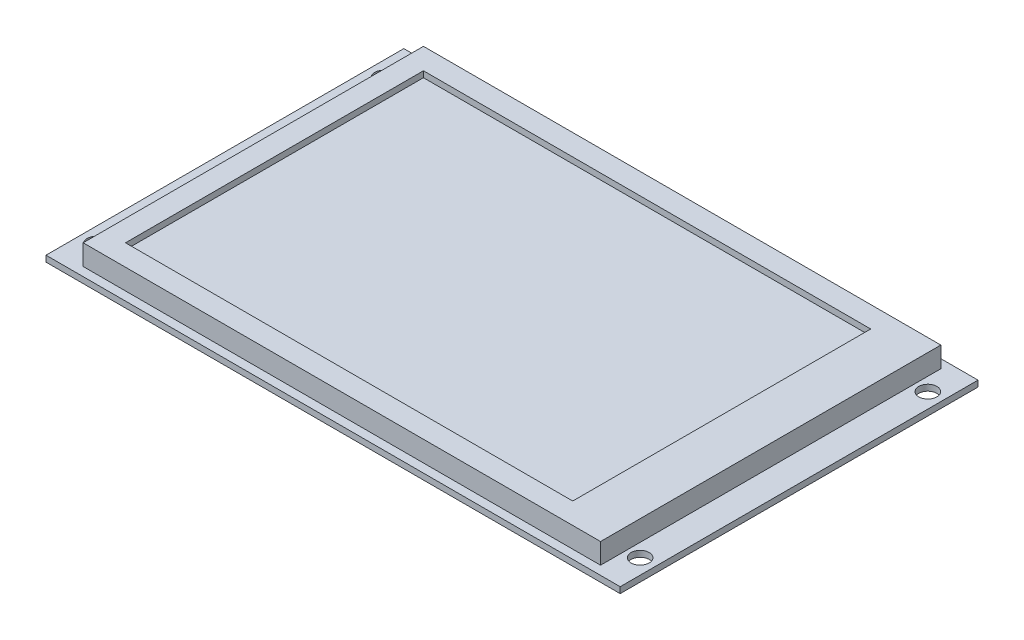
ISO-10303-21;
HEADER;
FILE_DESCRIPTION(('STEP AP214'),'2;1');
FILE_NAME('part.step','',(''),(''),'','','');
FILE_SCHEMA(('AUTOMOTIVE_DESIGN { 1 0 10303 214 1 1 1 1 }'));
ENDSEC;
DATA;
#1=APPLICATION_CONTEXT('core data for automotive mechanical design processes');
#2=APPLICATION_PROTOCOL_DEFINITION('international standard','automotive_design',2000,#1);
#3=PRODUCT_CONTEXT('',#1,'mechanical');
#4=PRODUCT('Part','Part','',(#3));
#5=PRODUCT_RELATED_PRODUCT_CATEGORY('part','',(#4));
#6=PRODUCT_DEFINITION_FORMATION('','',#4);
#7=PRODUCT_DEFINITION_CONTEXT('part definition',#1,'design');
#8=PRODUCT_DEFINITION('design','',#6,#7);
#9=PRODUCT_DEFINITION_SHAPE('','',#8);
#10=(LENGTH_UNIT() NAMED_UNIT(*) SI_UNIT(.MILLI.,.METRE.));
#11=(NAMED_UNIT(*) PLANE_ANGLE_UNIT() SI_UNIT($,.RADIAN.));
#12=(NAMED_UNIT(*) SI_UNIT($,.STERADIAN.) SOLID_ANGLE_UNIT());
#13=UNCERTAINTY_MEASURE_WITH_UNIT(LENGTH_MEASURE(1.E-05),#10,'distance_accuracy_value','');
#14=(GEOMETRIC_REPRESENTATION_CONTEXT(3) GLOBAL_UNCERTAINTY_ASSIGNED_CONTEXT((#13)) GLOBAL_UNIT_ASSIGNED_CONTEXT((#10,
#11,#12)) REPRESENTATION_CONTEXT('',''));
#15=CARTESIAN_POINT('',(0.,0.,0.));
#16=DIRECTION('',(0.,0.,1.));
#17=DIRECTION('',(1.,0.,0.));
#18=AXIS2_PLACEMENT_3D('',#15,#16,#17);
#19=CARTESIAN_POINT('',(0.,1.,0.));
#20=DIRECTION('',(0.,-1.,0.));
#21=DIRECTION('',(0.,0.,-1.));
#22=AXIS2_PLACEMENT_3D('',#19,#20,#21);
#23=PLANE('',#22);
#24=CARTESIAN_POINT('',(-45.35,1.,9.63000000000003));
#25=DIRECTION('',(0.,1.,0.));
#26=DIRECTION('',(0.,0.,1.));
#27=AXIS2_PLACEMENT_3D('',#24,#25,#26);
#28=CIRCLE('',#27,0.499999999999999);
#29=CARTESIAN_POINT('',(-45.35,1.,10.13));
#30=VERTEX_POINT('',#29);
#31=EDGE_CURVE('E249',#30,#30,#28,.T.);
#32=ORIENTED_EDGE('',*,*,#31,.F.);
#33=EDGE_LOOP('',(#32));
#34=FACE_BOUND('',#33,.T.);
#35=CARTESIAN_POINT('',(-45.35,1.,7.09000000000003));
#36=DIRECTION('',(0.,1.,0.));
#37=DIRECTION('',(0.,0.,1.));
#38=AXIS2_PLACEMENT_3D('',#35,#36,#37);
#39=CIRCLE('',#38,0.499999999999999);
#40=CARTESIAN_POINT('',(-45.35,1.,7.59000000000003));
#41=VERTEX_POINT('',#40);
#42=EDGE_CURVE('E704',#41,#41,#39,.T.);
#43=ORIENTED_EDGE('',*,*,#42,.F.);
#44=EDGE_LOOP('',(#43));
#45=FACE_BOUND('',#44,.T.);
#46=CARTESIAN_POINT('',(-45.35,1.,4.55000000000003));
#47=DIRECTION('',(0.,1.,0.));
#48=DIRECTION('',(0.,0.,1.));
#49=AXIS2_PLACEMENT_3D('',#46,#47,#48);
#50=CIRCLE('',#49,0.499999999999999);
#51=CARTESIAN_POINT('',(-45.35,1.,5.05000000000003));
#52=VERTEX_POINT('',#51);
#53=EDGE_CURVE('E707',#52,#52,#50,.T.);
#54=ORIENTED_EDGE('',*,*,#53,.F.);
#55=EDGE_LOOP('',(#54));
#56=FACE_BOUND('',#55,.T.);
#57=CARTESIAN_POINT('',(-45.35,1.,2.01000000000003));
#58=DIRECTION('',(0.,1.,0.));
#59=DIRECTION('',(0.,0.,1.));
#60=AXIS2_PLACEMENT_3D('',#57,#58,#59);
#61=CIRCLE('',#60,0.499999999999999);
#62=CARTESIAN_POINT('',(-45.35,1.,2.51000000000003));
#63=VERTEX_POINT('',#62);
#64=EDGE_CURVE('E712',#63,#63,#61,.T.);
#65=ORIENTED_EDGE('',*,*,#64,.F.);
#66=EDGE_LOOP('',(#65));
#67=FACE_BOUND('',#66,.T.);
#68=CARTESIAN_POINT('',(-45.35,1.,-0.529999999999971));
#69=DIRECTION('',(0.,1.,0.));
#70=DIRECTION('',(0.,0.,1.));
#71=AXIS2_PLACEMENT_3D('',#68,#69,#70);
#72=CIRCLE('',#71,0.499999999999999);
#73=CARTESIAN_POINT('',(-45.35,1.,-0.0299999999999723));
#74=VERTEX_POINT('',#73);
#75=EDGE_CURVE('E715',#74,#74,#72,.T.);
#76=ORIENTED_EDGE('',*,*,#75,.F.);
#77=EDGE_LOOP('',(#76));
#78=FACE_BOUND('',#77,.T.);
#79=CARTESIAN_POINT('',(-45.35,1.,-3.06999999999997));
#80=DIRECTION('',(0.,1.,0.));
#81=DIRECTION('',(0.,0.,1.));
#82=AXIS2_PLACEMENT_3D('',#79,#80,#81);
#83=CIRCLE('',#82,0.499999999999999);
#84=CARTESIAN_POINT('',(-45.35,1.,-2.56999999999997));
#85=VERTEX_POINT('',#84);
#86=EDGE_CURVE('E718',#85,#85,#83,.T.);
#87=ORIENTED_EDGE('',*,*,#86,.F.);
#88=EDGE_LOOP('',(#87));
#89=FACE_BOUND('',#88,.T.);
#90=CARTESIAN_POINT('',(-45.35,1.,-5.60999999999997));
#91=DIRECTION('',(0.,1.,0.));
#92=DIRECTION('',(0.,0.,1.));
#93=AXIS2_PLACEMENT_3D('',#90,#91,#92);
#94=CIRCLE('',#93,0.499999999999999);
#95=CARTESIAN_POINT('',(-45.35,1.,-5.10999999999997));
#96=VERTEX_POINT('',#95);
#97=EDGE_CURVE('E721',#96,#96,#94,.T.);
#98=ORIENTED_EDGE('',*,*,#97,.F.);
#99=EDGE_LOOP('',(#98));
#100=FACE_BOUND('',#99,.T.);
#101=CARTESIAN_POINT('',(-45.35,1.,-8.14999999999997));
#102=DIRECTION('',(0.,1.,0.));
#103=DIRECTION('',(0.,0.,1.));
#104=AXIS2_PLACEMENT_3D('',#101,#102,#103);
#105=CIRCLE('',#104,0.499999999999999);
#106=CARTESIAN_POINT('',(-45.35,1.,-7.64999999999997));
#107=VERTEX_POINT('',#106);
#108=EDGE_CURVE('E723',#107,#107,#105,.T.);
#109=ORIENTED_EDGE('',*,*,#108,.F.);
#110=EDGE_LOOP('',(#109));
#111=FACE_BOUND('',#110,.T.);
#112=CARTESIAN_POINT('',(-45.35,1.,-10.69));
#113=DIRECTION('',(0.,1.,0.));
#114=DIRECTION('',(0.,0.,1.));
#115=AXIS2_PLACEMENT_3D('',#112,#113,#114);
#116=CIRCLE('',#115,0.499999999999999);
#117=CARTESIAN_POINT('',(-45.35,1.,-10.19));
#118=VERTEX_POINT('',#117);
#119=EDGE_CURVE('E283',#118,#118,#116,.T.);
#120=ORIENTED_EDGE('',*,*,#119,.F.);
#121=EDGE_LOOP('',(#120));
#122=FACE_BOUND('',#121,.T.);
#123=CARTESIAN_POINT('',(45.,1.,-23.8));
#124=DIRECTION('',(0.,1.,0.));
#125=DIRECTION('',(0.,0.,-1.));
#126=AXIS2_PLACEMENT_3D('',#123,#124,#125);
#127=CIRCLE('',#126,1.5);
#128=CARTESIAN_POINT('',(45.,1.,-25.3));
#129=VERTEX_POINT('',#128);
#130=EDGE_CURVE('E280',#129,#129,#127,.T.);
#131=ORIENTED_EDGE('',*,*,#130,.F.);
#132=EDGE_LOOP('',(#131));
#133=FACE_BOUND('',#132,.T.);
#134=CARTESIAN_POINT('',(-45.,1.,23.8));
#135=DIRECTION('',(0.,1.,0.));
#136=DIRECTION('',(0.,0.,-1.));
#137=AXIS2_PLACEMENT_3D('',#134,#135,#136);
#138=CIRCLE('',#137,1.5);
#139=CARTESIAN_POINT('',(-45.,1.,22.3));
#140=VERTEX_POINT('',#139);
#141=EDGE_CURVE('E275',#140,#140,#138,.T.);
#142=ORIENTED_EDGE('',*,*,#141,.F.);
#143=EDGE_LOOP('',(#142));
#144=FACE_BOUND('',#143,.T.);
#145=CARTESIAN_POINT('',(-45.,1.,-23.8));
#146=DIRECTION('',(0.,1.,0.));
#147=DIRECTION('',(0.,0.,1.));
#148=AXIS2_PLACEMENT_3D('',#145,#146,#147);
#149=CIRCLE('',#148,1.5);
#150=CARTESIAN_POINT('',(-45.,1.,-22.3));
#151=VERTEX_POINT('',#150);
#152=EDGE_CURVE('E271',#151,#151,#149,.T.);
#153=ORIENTED_EDGE('',*,*,#152,.F.);
#154=EDGE_LOOP('',(#153));
#155=FACE_BOUND('',#154,.T.);
#156=CARTESIAN_POINT('',(45.,1.,23.8));
#157=DIRECTION('',(0.,1.,0.));
#158=DIRECTION('',(0.,0.,1.));
#159=AXIS2_PLACEMENT_3D('',#156,#157,#158);
#160=CIRCLE('',#159,1.5);
#161=CARTESIAN_POINT('',(45.,1.,25.3));
#162=VERTEX_POINT('',#161);
#163=EDGE_CURVE('E162',#162,#162,#160,.T.);
#164=ORIENTED_EDGE('',*,*,#163,.F.);
#165=EDGE_LOOP('',(#164));
#166=FACE_BOUND('',#165,.T.);
#167=DIRECTION('',(0.,0.,1.));
#168=VECTOR('',#167,1.);
#169=CARTESIAN_POINT('',(-47.5,1.,-29.6));
#170=LINE('',#169,#168);
#171=CARTESIAN_POINT('',(-47.5,1.,-29.6));
#172=VERTEX_POINT('',#171);
#173=CARTESIAN_POINT('',(-47.5,1.,29.6));
#174=VERTEX_POINT('',#173);
#175=EDGE_CURVE('E209',#172,#174,#170,.T.);
#176=ORIENTED_EDGE('',*,*,#175,.T.);
#177=DIRECTION('',(1.,0.,0.));
#178=VECTOR('',#177,1.);
#179=CARTESIAN_POINT('',(47.5,1.,29.6));
#180=LINE('',#179,#178);
#181=CARTESIAN_POINT('',(47.5,1.,29.6));
#182=VERTEX_POINT('',#181);
#183=EDGE_CURVE('E212',#174,#182,#180,.T.);
#184=ORIENTED_EDGE('',*,*,#183,.T.);
#185=DIRECTION('',(0.,0.,-1.));
#186=VECTOR('',#185,1.);
#187=CARTESIAN_POINT('',(47.5,1.,-29.6));
#188=LINE('',#187,#186);
#189=CARTESIAN_POINT('',(47.5,1.,-29.6));
#190=VERTEX_POINT('',#189);
#191=EDGE_CURVE('E215',#182,#190,#188,.T.);
#192=ORIENTED_EDGE('',*,*,#191,.T.);
#193=DIRECTION('',(-1.,0.,0.));
#194=VECTOR('',#193,1.);
#195=CARTESIAN_POINT('',(47.5,1.,-29.6));
#196=LINE('',#195,#194);
#197=EDGE_CURVE('E217',#190,#172,#196,.T.);
#198=ORIENTED_EDGE('',*,*,#197,.T.);
#199=EDGE_LOOP('',(#176,#184,#192,#198));
#200=FACE_BOUND('',#199,.T.);
#201=DIRECTION('',(0.,0.,1.));
#202=VECTOR('',#201,1.);
#203=CARTESIAN_POINT('',(-42.8,1.,-28.15));
#204=LINE('',#203,#202);
#205=CARTESIAN_POINT('',(-42.8,1.,-28.15));
#206=VERTEX_POINT('',#205);
#207=CARTESIAN_POINT('',(-42.8,1.,28.15));
#208=VERTEX_POINT('',#207);
#209=EDGE_CURVE('E70',#206,#208,#204,.T.);
#210=ORIENTED_EDGE('',*,*,#209,.F.);
#211=DIRECTION('',(-1.,0.,0.));
#212=VECTOR('',#211,1.);
#213=CARTESIAN_POINT('',(42.8,1.,-28.15));
#214=LINE('',#213,#212);
#215=CARTESIAN_POINT('',(42.8,1.,-28.15));
#216=VERTEX_POINT('',#215);
#217=EDGE_CURVE('E182',#216,#206,#214,.T.);
#218=ORIENTED_EDGE('',*,*,#217,.F.);
#219=DIRECTION('',(0.,0.,-1.));
#220=VECTOR('',#219,1.);
#221=CARTESIAN_POINT('',(42.8,1.,-28.15));
#222=LINE('',#221,#220);
#223=CARTESIAN_POINT('',(42.8,1.,28.15));
#224=VERTEX_POINT('',#223);
#225=EDGE_CURVE('E193',#224,#216,#222,.T.);
#226=ORIENTED_EDGE('',*,*,#225,.F.);
#227=DIRECTION('',(1.,0.,0.));
#228=VECTOR('',#227,1.);
#229=CARTESIAN_POINT('',(42.8,1.,28.15));
#230=LINE('',#229,#228);
#231=EDGE_CURVE('E190',#208,#224,#230,.T.);
#232=ORIENTED_EDGE('',*,*,#231,.F.);
#233=EDGE_LOOP('',(#210,#218,#226,#232));
#234=FACE_BOUND('',#233,.T.);
#235=ADVANCED_FACE('F45',(#34,#45,#56,#67,#78,#89,#100,#111,#122,#133,#144,#155,#166,#200,#234),
#23,.F.);
#236=CARTESIAN_POINT('',(-47.5,1.,-29.6));
#237=DIRECTION('',(1.,0.,0.));
#238=DIRECTION('',(0.,0.,-1.));
#239=AXIS2_PLACEMENT_3D('',#236,#237,#238);
#240=PLANE('',#239);
#241=DIRECTION('',(0.,0.,1.));
#242=VECTOR('',#241,1.);
#243=CARTESIAN_POINT('',(-47.5,0.,-29.6));
#244=LINE('',#243,#242);
#245=CARTESIAN_POINT('',(-47.5,0.,-29.6));
#246=VERTEX_POINT('',#245);
#247=CARTESIAN_POINT('',(-47.5,0.,29.6));
#248=VERTEX_POINT('',#247);
#249=EDGE_CURVE('E208',#246,#248,#244,.T.);
#250=ORIENTED_EDGE('',*,*,#249,.T.);
#251=DIRECTION('',(0.,-1.,0.));
#252=VECTOR('',#251,1.);
#253=CARTESIAN_POINT('',(-47.5,1.,29.6));
#254=LINE('',#253,#252);
#255=EDGE_CURVE('E11',#174,#248,#254,.T.);
#256=ORIENTED_EDGE('',*,*,#255,.F.);
#257=ORIENTED_EDGE('',*,*,#175,.F.);
#258=DIRECTION('',(0.,-1.,0.));
#259=VECTOR('',#258,1.);
#260=CARTESIAN_POINT('',(-47.5,1.,-29.6));
#261=LINE('',#260,#259);
#262=EDGE_CURVE('E219',#172,#246,#261,.T.);
#263=ORIENTED_EDGE('',*,*,#262,.T.);
#264=EDGE_LOOP('',(#250,#256,#257,#263));
#265=FACE_BOUND('',#264,.T.);
#266=ADVANCED_FACE('F47',(#265),#240,.F.);
#267=CARTESIAN_POINT('',(47.5,1.,29.6));
#268=DIRECTION('',(0.,0.,-1.));
#269=DIRECTION('',(-1.,0.,0.));
#270=AXIS2_PLACEMENT_3D('',#267,#268,#269);
#271=PLANE('',#270);
#272=DIRECTION('',(1.,0.,0.));
#273=VECTOR('',#272,1.);
#274=CARTESIAN_POINT('',(47.5,0.,29.6));
#275=LINE('',#274,#273);
#276=CARTESIAN_POINT('',(47.5,0.,29.6));
#277=VERTEX_POINT('',#276);
#278=EDGE_CURVE('E222',#248,#277,#275,.T.);
#279=ORIENTED_EDGE('',*,*,#278,.T.);
#280=DIRECTION('',(0.,-1.,0.));
#281=VECTOR('',#280,1.);
#282=CARTESIAN_POINT('',(47.5,1.,29.6));
#283=LINE('',#282,#281);
#284=EDGE_CURVE('E54',#182,#277,#283,.T.);
#285=ORIENTED_EDGE('',*,*,#284,.F.);
#286=ORIENTED_EDGE('',*,*,#183,.F.);
#287=ORIENTED_EDGE('',*,*,#255,.T.);
#288=EDGE_LOOP('',(#279,#285,#286,#287));
#289=FACE_BOUND('',#288,.T.);
#290=ADVANCED_FACE('F305',(#289),#271,.F.);
#291=CARTESIAN_POINT('',(47.5,1.,-29.6));
#292=DIRECTION('',(-1.,0.,0.));
#293=DIRECTION('',(0.,0.,1.));
#294=AXIS2_PLACEMENT_3D('',#291,#292,#293);
#295=PLANE('',#294);
#296=DIRECTION('',(0.,0.,-1.));
#297=VECTOR('',#296,1.);
#298=CARTESIAN_POINT('',(47.5,0.,-29.6));
#299=LINE('',#298,#297);
#300=CARTESIAN_POINT('',(47.5,0.,-29.6));
#301=VERTEX_POINT('',#300);
#302=EDGE_CURVE('E224',#277,#301,#299,.T.);
#303=ORIENTED_EDGE('',*,*,#302,.T.);
#304=DIRECTION('',(0.,-1.,0.));
#305=VECTOR('',#304,1.);
#306=CARTESIAN_POINT('',(47.5,1.,-29.6));
#307=LINE('',#306,#305);
#308=EDGE_CURVE('E229',#190,#301,#307,.T.);
#309=ORIENTED_EDGE('',*,*,#308,.F.);
#310=ORIENTED_EDGE('',*,*,#191,.F.);
#311=ORIENTED_EDGE('',*,*,#284,.T.);
#312=EDGE_LOOP('',(#303,#309,#310,#311));
#313=FACE_BOUND('',#312,.T.);
#314=ADVANCED_FACE('F310',(#313),#295,.F.);
#315=CARTESIAN_POINT('',(47.5,1.,-29.6));
#316=DIRECTION('',(0.,0.,1.));
#317=DIRECTION('',(1.,0.,0.));
#318=AXIS2_PLACEMENT_3D('',#315,#316,#317);
#319=PLANE('',#318);
#320=DIRECTION('',(-1.,0.,0.));
#321=VECTOR('',#320,1.);
#322=CARTESIAN_POINT('',(47.5,0.,-29.6));
#323=LINE('',#322,#321);
#324=EDGE_CURVE('E213',#301,#246,#323,.T.);
#325=ORIENTED_EDGE('',*,*,#324,.T.);
#326=ORIENTED_EDGE('',*,*,#262,.F.);
#327=ORIENTED_EDGE('',*,*,#197,.F.);
#328=ORIENTED_EDGE('',*,*,#308,.T.);
#329=EDGE_LOOP('',(#325,#326,#327,#328));
#330=FACE_BOUND('',#329,.T.);
#331=ADVANCED_FACE('F313',(#330),#319,.F.);
#332=CARTESIAN_POINT('',(0.,0.,0.));
#333=DIRECTION('',(0.,-1.,0.));
#334=DIRECTION('',(0.,0.,-1.));
#335=AXIS2_PLACEMENT_3D('',#332,#333,#334);
#336=PLANE('',#335);
#337=CARTESIAN_POINT('',(-45.35,0.,9.63000000000003));
#338=DIRECTION('',(0.,-1.,0.));
#339=DIRECTION('',(0.,0.,-1.));
#340=AXIS2_PLACEMENT_3D('',#337,#338,#339);
#341=CIRCLE('',#340,0.499999999999999);
#342=CARTESIAN_POINT('',(-45.35,0.,9.13000000000003));
#343=VERTEX_POINT('',#342);
#344=EDGE_CURVE('E49',#343,#343,#341,.T.);
#345=ORIENTED_EDGE('',*,*,#344,.F.);
#346=EDGE_LOOP('',(#345));
#347=FACE_BOUND('',#346,.T.);
#348=CARTESIAN_POINT('',(-45.35,0.,7.09000000000003));
#349=DIRECTION('',(0.,-1.,0.));
#350=DIRECTION('',(0.,0.,-1.));
#351=AXIS2_PLACEMENT_3D('',#348,#349,#350);
#352=CIRCLE('',#351,0.499999999999999);
#353=CARTESIAN_POINT('',(-45.35,0.,6.59000000000003));
#354=VERTEX_POINT('',#353);
#355=EDGE_CURVE('E266',#354,#354,#352,.T.);
#356=ORIENTED_EDGE('',*,*,#355,.F.);
#357=EDGE_LOOP('',(#356));
#358=FACE_BOUND('',#357,.T.);
#359=CARTESIAN_POINT('',(-45.35,0.,4.55000000000003));
#360=DIRECTION('',(0.,-1.,0.));
#361=DIRECTION('',(0.,0.,-1.));
#362=AXIS2_PLACEMENT_3D('',#359,#360,#361);
#363=CIRCLE('',#362,0.499999999999999);
#364=CARTESIAN_POINT('',(-45.35,0.,4.05000000000003));
#365=VERTEX_POINT('',#364);
#366=EDGE_CURVE('E264',#365,#365,#363,.T.);
#367=ORIENTED_EDGE('',*,*,#366,.F.);
#368=EDGE_LOOP('',(#367));
#369=FACE_BOUND('',#368,.T.);
#370=CARTESIAN_POINT('',(-45.35,0.,2.01000000000003));
#371=DIRECTION('',(0.,-1.,0.));
#372=DIRECTION('',(0.,0.,-1.));
#373=AXIS2_PLACEMENT_3D('',#370,#371,#372);
#374=CIRCLE('',#373,0.499999999999999);
#375=CARTESIAN_POINT('',(-45.35,0.,1.51000000000003));
#376=VERTEX_POINT('',#375);
#377=EDGE_CURVE('E261',#376,#376,#374,.T.);
#378=ORIENTED_EDGE('',*,*,#377,.F.);
#379=EDGE_LOOP('',(#378));
#380=FACE_BOUND('',#379,.T.);
#381=CARTESIAN_POINT('',(-45.35,0.,-0.529999999999971));
#382=DIRECTION('',(0.,-1.,0.));
#383=DIRECTION('',(0.,0.,-1.));
#384=AXIS2_PLACEMENT_3D('',#381,#382,#383);
#385=CIRCLE('',#384,0.499999999999999);
#386=CARTESIAN_POINT('',(-45.35,0.,-1.02999999999997));
#387=VERTEX_POINT('',#386);
#388=EDGE_CURVE('E258',#387,#387,#385,.T.);
#389=ORIENTED_EDGE('',*,*,#388,.F.);
#390=EDGE_LOOP('',(#389));
#391=FACE_BOUND('',#390,.T.);
#392=CARTESIAN_POINT('',(-45.35,0.,-3.06999999999997));
#393=DIRECTION('',(0.,-1.,0.));
#394=DIRECTION('',(0.,0.,-1.));
#395=AXIS2_PLACEMENT_3D('',#392,#393,#394);
#396=CIRCLE('',#395,0.499999999999999);
#397=CARTESIAN_POINT('',(-45.35,0.,-3.56999999999997));
#398=VERTEX_POINT('',#397);
#399=EDGE_CURVE('E255',#398,#398,#396,.T.);
#400=ORIENTED_EDGE('',*,*,#399,.F.);
#401=EDGE_LOOP('',(#400));
#402=FACE_BOUND('',#401,.T.);
#403=CARTESIAN_POINT('',(-45.35,0.,-5.60999999999997));
#404=DIRECTION('',(0.,-1.,0.));
#405=DIRECTION('',(0.,0.,-1.));
#406=AXIS2_PLACEMENT_3D('',#403,#404,#405);
#407=CIRCLE('',#406,0.499999999999999);
#408=CARTESIAN_POINT('',(-45.35,0.,-6.10999999999997));
#409=VERTEX_POINT('',#408);
#410=EDGE_CURVE('E252',#409,#409,#407,.T.);
#411=ORIENTED_EDGE('',*,*,#410,.F.);
#412=EDGE_LOOP('',(#411));
#413=FACE_BOUND('',#412,.T.);
#414=CARTESIAN_POINT('',(-45.35,0.,-8.14999999999997));
#415=DIRECTION('',(0.,-1.,0.));
#416=DIRECTION('',(0.,0.,-1.));
#417=AXIS2_PLACEMENT_3D('',#414,#415,#416);
#418=CIRCLE('',#417,0.499999999999999);
#419=CARTESIAN_POINT('',(-45.35,0.,-8.64999999999997));
#420=VERTEX_POINT('',#419);
#421=EDGE_CURVE('E248',#420,#420,#418,.T.);
#422=ORIENTED_EDGE('',*,*,#421,.F.);
#423=EDGE_LOOP('',(#422));
#424=FACE_BOUND('',#423,.T.);
#425=CARTESIAN_POINT('',(-45.35,0.,-10.69));
#426=DIRECTION('',(0.,-1.,0.));
#427=DIRECTION('',(0.,0.,-1.));
#428=AXIS2_PLACEMENT_3D('',#425,#426,#427);
#429=CIRCLE('',#428,0.499999999999999);
#430=CARTESIAN_POINT('',(-45.35,0.,-11.19));
#431=VERTEX_POINT('',#430);
#432=EDGE_CURVE('E245',#431,#431,#429,.T.);
#433=ORIENTED_EDGE('',*,*,#432,.F.);
#434=EDGE_LOOP('',(#433));
#435=FACE_BOUND('',#434,.T.);
#436=CARTESIAN_POINT('',(45.,0.,-23.8));
#437=DIRECTION('',(0.,-1.,0.));
#438=DIRECTION('',(0.,0.,-1.));
#439=AXIS2_PLACEMENT_3D('',#436,#437,#438);
#440=CIRCLE('',#439,1.5);
#441=CARTESIAN_POINT('',(45.,0.,-25.3));
#442=VERTEX_POINT('',#441);
#443=EDGE_CURVE('E169',#442,#442,#440,.T.);
#444=ORIENTED_EDGE('',*,*,#443,.F.);
#445=EDGE_LOOP('',(#444));
#446=FACE_BOUND('',#445,.T.);
#447=CARTESIAN_POINT('',(-45.,0.,23.8));
#448=DIRECTION('',(0.,-1.,0.));
#449=DIRECTION('',(0.,0.,-1.));
#450=AXIS2_PLACEMENT_3D('',#447,#448,#449);
#451=CIRCLE('',#450,1.5);
#452=CARTESIAN_POINT('',(-45.,0.,22.3));
#453=VERTEX_POINT('',#452);
#454=EDGE_CURVE('E240',#453,#453,#451,.T.);
#455=ORIENTED_EDGE('',*,*,#454,.F.);
#456=EDGE_LOOP('',(#455));
#457=FACE_BOUND('',#456,.T.);
#458=CARTESIAN_POINT('',(-45.,0.,-23.8));
#459=DIRECTION('',(0.,-1.,0.));
#460=DIRECTION('',(0.,0.,-1.));
#461=AXIS2_PLACEMENT_3D('',#458,#459,#460);
#462=CIRCLE('',#461,1.5);
#463=CARTESIAN_POINT('',(-45.,0.,-25.3));
#464=VERTEX_POINT('',#463);
#465=EDGE_CURVE('E237',#464,#464,#462,.T.);
#466=ORIENTED_EDGE('',*,*,#465,.F.);
#467=EDGE_LOOP('',(#466));
#468=FACE_BOUND('',#467,.T.);
#469=CARTESIAN_POINT('',(45.,0.,23.8));
#470=DIRECTION('',(0.,-1.,0.));
#471=DIRECTION('',(0.,0.,-1.));
#472=AXIS2_PLACEMENT_3D('',#469,#470,#471);
#473=CIRCLE('',#472,1.5);
#474=CARTESIAN_POINT('',(45.,0.,22.3));
#475=VERTEX_POINT('',#474);
#476=EDGE_CURVE('E234',#475,#475,#473,.T.);
#477=ORIENTED_EDGE('',*,*,#476,.F.);
#478=EDGE_LOOP('',(#477));
#479=FACE_BOUND('',#478,.T.);
#480=ORIENTED_EDGE('',*,*,#249,.F.);
#481=ORIENTED_EDGE('',*,*,#324,.F.);
#482=ORIENTED_EDGE('',*,*,#302,.F.);
#483=ORIENTED_EDGE('',*,*,#278,.F.);
#484=EDGE_LOOP('',(#480,#481,#482,#483));
#485=FACE_BOUND('',#484,.T.);
#486=ADVANCED_FACE('F315',(#347,#358,#369,#380,#391,#402,#413,#424,#435,#446,#457,#468,#479,
#485),#336,.T.);
#487=CARTESIAN_POINT('',(-42.8,4.4,-28.15));
#488=DIRECTION('',(1.,0.,0.));
#489=DIRECTION('',(0.,0.,-1.));
#490=AXIS2_PLACEMENT_3D('',#487,#488,#489);
#491=PLANE('',#490);
#492=ORIENTED_EDGE('',*,*,#209,.T.);
#493=DIRECTION('',(0.,-1.,0.));
#494=VECTOR('',#493,1.);
#495=CARTESIAN_POINT('',(-42.8,4.4,28.15));
#496=LINE('',#495,#494);
#497=CARTESIAN_POINT('',(-42.8,4.4,28.15));
#498=VERTEX_POINT('',#497);
#499=EDGE_CURVE('E205',#498,#208,#496,.T.);
#500=ORIENTED_EDGE('',*,*,#499,.F.);
#501=DIRECTION('',(0.,0.,1.));
#502=VECTOR('',#501,1.);
#503=CARTESIAN_POINT('',(-42.8,4.4,-28.15));
#504=LINE('',#503,#502);
#505=CARTESIAN_POINT('',(-42.8,4.4,-28.15));
#506=VERTEX_POINT('',#505);
#507=EDGE_CURVE('E178',#506,#498,#504,.T.);
#508=ORIENTED_EDGE('',*,*,#507,.F.);
#509=DIRECTION('',(0.,-1.,0.));
#510=VECTOR('',#509,1.);
#511=CARTESIAN_POINT('',(-42.8,4.4,-28.15));
#512=LINE('',#511,#510);
#513=EDGE_CURVE('E188',#506,#206,#512,.T.);
#514=ORIENTED_EDGE('',*,*,#513,.T.);
#515=EDGE_LOOP('',(#492,#500,#508,#514));
#516=FACE_BOUND('',#515,.T.);
#517=ADVANCED_FACE('F317',(#516),#491,.F.);
#518=CARTESIAN_POINT('',(42.8,4.4,28.15));
#519=DIRECTION('',(0.,0.,-1.));
#520=DIRECTION('',(-1.,0.,0.));
#521=AXIS2_PLACEMENT_3D('',#518,#519,#520);
#522=PLANE('',#521);
#523=ORIENTED_EDGE('',*,*,#231,.T.);
#524=DIRECTION('',(0.,-1.,0.));
#525=VECTOR('',#524,1.);
#526=CARTESIAN_POINT('',(42.8,4.4,28.15));
#527=LINE('',#526,#525);
#528=CARTESIAN_POINT('',(42.8,4.4,28.15));
#529=VERTEX_POINT('',#528);
#530=EDGE_CURVE('E202',#529,#224,#527,.T.);
#531=ORIENTED_EDGE('',*,*,#530,.F.);
#532=DIRECTION('',(1.,0.,0.));
#533=VECTOR('',#532,1.);
#534=CARTESIAN_POINT('',(42.8,4.4,28.15));
#535=LINE('',#534,#533);
#536=EDGE_CURVE('E181',#498,#529,#535,.T.);
#537=ORIENTED_EDGE('',*,*,#536,.F.);
#538=ORIENTED_EDGE('',*,*,#499,.T.);
#539=EDGE_LOOP('',(#523,#531,#537,#538));
#540=FACE_BOUND('',#539,.T.);
#541=ADVANCED_FACE('F324',(#540),#522,.F.);
#542=CARTESIAN_POINT('',(42.8,4.4,-28.15));
#543=DIRECTION('',(-1.,0.,0.));
#544=DIRECTION('',(0.,0.,1.));
#545=AXIS2_PLACEMENT_3D('',#542,#543,#544);
#546=PLANE('',#545);
#547=ORIENTED_EDGE('',*,*,#225,.T.);
#548=DIRECTION('',(0.,-1.,0.));
#549=VECTOR('',#548,1.);
#550=CARTESIAN_POINT('',(42.8,4.4,-28.15));
#551=LINE('',#550,#549);
#552=CARTESIAN_POINT('',(42.8,4.4,-28.15));
#553=VERTEX_POINT('',#552);
#554=EDGE_CURVE('E199',#553,#216,#551,.T.);
#555=ORIENTED_EDGE('',*,*,#554,.F.);
#556=DIRECTION('',(0.,0.,-1.));
#557=VECTOR('',#556,1.);
#558=CARTESIAN_POINT('',(42.8,4.4,-28.15));
#559=LINE('',#558,#557);
#560=EDGE_CURVE('E184',#529,#553,#559,.T.);
#561=ORIENTED_EDGE('',*,*,#560,.F.);
#562=ORIENTED_EDGE('',*,*,#530,.T.);
#563=EDGE_LOOP('',(#547,#555,#561,#562));
#564=FACE_BOUND('',#563,.T.);
#565=ADVANCED_FACE('F519',(#564),#546,.F.);
#566=CARTESIAN_POINT('',(42.8,4.4,-28.15));
#567=DIRECTION('',(0.,0.,1.));
#568=DIRECTION('',(1.,0.,0.));
#569=AXIS2_PLACEMENT_3D('',#566,#567,#568);
#570=PLANE('',#569);
#571=ORIENTED_EDGE('',*,*,#217,.T.);
#572=ORIENTED_EDGE('',*,*,#513,.F.);
#573=DIRECTION('',(-1.,0.,0.));
#574=VECTOR('',#573,1.);
#575=CARTESIAN_POINT('',(42.8,4.4,-28.15));
#576=LINE('',#575,#574);
#577=EDGE_CURVE('E186',#553,#506,#576,.T.);
#578=ORIENTED_EDGE('',*,*,#577,.F.);
#579=ORIENTED_EDGE('',*,*,#554,.T.);
#580=EDGE_LOOP('',(#571,#572,#578,#579));
#581=FACE_BOUND('',#580,.T.);
#582=ADVANCED_FACE('F511',(#581),#570,.F.);
#583=CARTESIAN_POINT('',(0.,4.4,0.));
#584=DIRECTION('',(0.,-1.,0.));
#585=DIRECTION('',(0.,0.,-1.));
#586=AXIS2_PLACEMENT_3D('',#583,#584,#585);
#587=PLANE('',#586);
#588=DIRECTION('',(1.,0.,0.));
#589=VECTOR('',#588,1.);
#590=CARTESIAN_POINT('',(-39.3,4.4,24.65));
#591=LINE('',#590,#589);
#592=CARTESIAN_POINT('',(-39.3,4.4,24.65));
#593=VERTEX_POINT('',#592);
#594=CARTESIAN_POINT('',(34.7,4.4,24.65));
#595=VERTEX_POINT('',#594);
#596=EDGE_CURVE('E168',#593,#595,#591,.T.);
#597=ORIENTED_EDGE('',*,*,#596,.F.);
#598=DIRECTION('',(0.,0.,1.));
#599=VECTOR('',#598,1.);
#600=CARTESIAN_POINT('',(-39.3,4.4,-24.65));
#601=LINE('',#600,#599);
#602=CARTESIAN_POINT('',(-39.3,4.4,-24.65));
#603=VERTEX_POINT('',#602);
#604=EDGE_CURVE('E62',#603,#593,#601,.T.);
#605=ORIENTED_EDGE('',*,*,#604,.F.);
#606=DIRECTION('',(-1.,0.,0.));
#607=VECTOR('',#606,1.);
#608=CARTESIAN_POINT('',(-39.3,4.4,-24.65));
#609=LINE('',#608,#607);
#610=CARTESIAN_POINT('',(34.7,4.4,-24.65));
#611=VERTEX_POINT('',#610);
#612=EDGE_CURVE('E156',#611,#603,#609,.T.);
#613=ORIENTED_EDGE('',*,*,#612,.F.);
#614=DIRECTION('',(0.,0.,-1.));
#615=VECTOR('',#614,1.);
#616=CARTESIAN_POINT('',(34.7,4.4,-24.65));
#617=LINE('',#616,#615);
#618=EDGE_CURVE('E159',#595,#611,#617,.T.);
#619=ORIENTED_EDGE('',*,*,#618,.F.);
#620=EDGE_LOOP('',(#597,#605,#613,#619));
#621=FACE_BOUND('',#620,.T.);
#622=ORIENTED_EDGE('',*,*,#507,.T.);
#623=ORIENTED_EDGE('',*,*,#536,.T.);
#624=ORIENTED_EDGE('',*,*,#560,.T.);
#625=ORIENTED_EDGE('',*,*,#577,.T.);
#626=EDGE_LOOP('',(#622,#623,#624,#625));
#627=FACE_BOUND('',#626,.T.);
#628=ADVANCED_FACE('F508',(#621,#627),#587,.F.);
#629=CARTESIAN_POINT('',(-39.3,3.4,-24.65));
#630=DIRECTION('',(-1.,0.,0.));
#631=DIRECTION('',(0.,0.,1.));
#632=AXIS2_PLACEMENT_3D('',#629,#630,#631);
#633=PLANE('',#632);
#634=ORIENTED_EDGE('',*,*,#604,.T.);
#635=DIRECTION('',(0.,1.,0.));
#636=VECTOR('',#635,1.);
#637=CARTESIAN_POINT('',(-39.3,3.4,24.65));
#638=LINE('',#637,#636);
#639=CARTESIAN_POINT('',(-39.3,3.4,24.65));
#640=VERTEX_POINT('',#639);
#641=EDGE_CURVE('E134',#640,#593,#638,.T.);
#642=ORIENTED_EDGE('',*,*,#641,.F.);
#643=DIRECTION('',(0.,0.,1.));
#644=VECTOR('',#643,1.);
#645=CARTESIAN_POINT('',(-39.3,3.4,-24.65));
#646=LINE('',#645,#644);
#647=CARTESIAN_POINT('',(-39.3,3.4,-24.65));
#648=VERTEX_POINT('',#647);
#649=EDGE_CURVE('E138',#648,#640,#646,.T.);
#650=ORIENTED_EDGE('',*,*,#649,.F.);
#651=DIRECTION('',(0.,1.,0.));
#652=VECTOR('',#651,1.);
#653=CARTESIAN_POINT('',(-39.3,3.4,-24.65));
#654=LINE('',#653,#652);
#655=EDGE_CURVE('E173',#648,#603,#654,.T.);
#656=ORIENTED_EDGE('',*,*,#655,.T.);
#657=EDGE_LOOP('',(#634,#642,#650,#656));
#658=FACE_BOUND('',#657,.T.);
#659=ADVANCED_FACE('F136',(#658),#633,.F.);
#660=CARTESIAN_POINT('',(-39.3,3.4,-24.65));
#661=DIRECTION('',(0.,0.,-1.));
#662=DIRECTION('',(-1.,0.,0.));
#663=AXIS2_PLACEMENT_3D('',#660,#661,#662);
#664=PLANE('',#663);
#665=ORIENTED_EDGE('',*,*,#612,.T.);
#666=ORIENTED_EDGE('',*,*,#655,.F.);
#667=DIRECTION('',(-1.,0.,0.));
#668=VECTOR('',#667,1.);
#669=CARTESIAN_POINT('',(-39.3,3.4,-24.65));
#670=LINE('',#669,#668);
#671=CARTESIAN_POINT('',(34.7,3.4,-24.65));
#672=VERTEX_POINT('',#671);
#673=EDGE_CURVE('E144',#672,#648,#670,.T.);
#674=ORIENTED_EDGE('',*,*,#673,.F.);
#675=DIRECTION('',(0.,1.,0.));
#676=VECTOR('',#675,1.);
#677=CARTESIAN_POINT('',(34.7,3.4,-24.65));
#678=LINE('',#677,#676);
#679=EDGE_CURVE('E175',#672,#611,#678,.T.);
#680=ORIENTED_EDGE('',*,*,#679,.T.);
#681=EDGE_LOOP('',(#665,#666,#674,#680));
#682=FACE_BOUND('',#681,.T.);
#683=ADVANCED_FACE('F571',(#682),#664,.F.);
#684=CARTESIAN_POINT('',(34.7,3.4,-24.65));
#685=DIRECTION('',(1.,0.,0.));
#686=DIRECTION('',(0.,0.,-1.));
#687=AXIS2_PLACEMENT_3D('',#684,#685,#686);
#688=PLANE('',#687);
#689=ORIENTED_EDGE('',*,*,#618,.T.);
#690=ORIENTED_EDGE('',*,*,#679,.F.);
#691=DIRECTION('',(0.,0.,-1.));
#692=VECTOR('',#691,1.);
#693=CARTESIAN_POINT('',(34.7,3.4,-24.65));
#694=LINE('',#693,#692);
#695=CARTESIAN_POINT('',(34.7,3.4,24.65));
#696=VERTEX_POINT('',#695);
#697=EDGE_CURVE('E152',#696,#672,#694,.T.);
#698=ORIENTED_EDGE('',*,*,#697,.F.);
#699=DIRECTION('',(0.,1.,0.));
#700=VECTOR('',#699,1.);
#701=CARTESIAN_POINT('',(34.7,3.4,24.65));
#702=LINE('',#701,#700);
#703=EDGE_CURVE('E143',#696,#595,#702,.T.);
#704=ORIENTED_EDGE('',*,*,#703,.T.);
#705=EDGE_LOOP('',(#689,#690,#698,#704));
#706=FACE_BOUND('',#705,.T.);
#707=ADVANCED_FACE('F579',(#706),#688,.F.);
#708=CARTESIAN_POINT('',(-39.3,3.4,24.65));
#709=DIRECTION('',(0.,0.,1.));
#710=DIRECTION('',(1.,0.,0.));
#711=AXIS2_PLACEMENT_3D('',#708,#709,#710);
#712=PLANE('',#711);
#713=ORIENTED_EDGE('',*,*,#596,.T.);
#714=ORIENTED_EDGE('',*,*,#703,.F.);
#715=DIRECTION('',(1.,0.,0.));
#716=VECTOR('',#715,1.);
#717=CARTESIAN_POINT('',(-39.3,3.4,24.65));
#718=LINE('',#717,#716);
#719=EDGE_CURVE('E147',#640,#696,#718,.T.);
#720=ORIENTED_EDGE('',*,*,#719,.F.);
#721=ORIENTED_EDGE('',*,*,#641,.T.);
#722=EDGE_LOOP('',(#713,#714,#720,#721));
#723=FACE_BOUND('',#722,.T.);
#724=ADVANCED_FACE('F148',(#723),#712,.F.);
#725=CARTESIAN_POINT('',(0.,3.4,0.));
#726=DIRECTION('',(0.,1.,0.));
#727=DIRECTION('',(0.,0.,1.));
#728=AXIS2_PLACEMENT_3D('',#725,#726,#727);
#729=PLANE('',#728);
#730=ORIENTED_EDGE('',*,*,#649,.T.);
#731=ORIENTED_EDGE('',*,*,#719,.T.);
#732=ORIENTED_EDGE('',*,*,#697,.T.);
#733=ORIENTED_EDGE('',*,*,#673,.T.);
#734=EDGE_LOOP('',(#730,#731,#732,#733));
#735=FACE_BOUND('',#734,.T.);
#736=ADVANCED_FACE('F154',(#735),#729,.T.);
#737=CARTESIAN_POINT('',(45.,-10.,23.8));
#738=DIRECTION('',(0.,1.,0.));
#739=DIRECTION('',(0.,0.,1.));
#740=AXIS2_PLACEMENT_3D('',#737,#738,#739);
#741=CYLINDRICAL_SURFACE('',#740,1.5);
#742=ORIENTED_EDGE('',*,*,#476,.T.);
#743=EDGE_LOOP('',(#742));
#744=FACE_BOUND('',#743,.T.);
#745=ORIENTED_EDGE('',*,*,#163,.T.);
#746=EDGE_LOOP('',(#745));
#747=FACE_BOUND('',#746,.T.);
#748=ADVANCED_FACE('F291',(#744,#747),#741,.F.);
#749=CARTESIAN_POINT('',(-45.,-10.,-23.8));
#750=DIRECTION('',(0.,1.,0.));
#751=DIRECTION('',(0.,0.,1.));
#752=AXIS2_PLACEMENT_3D('',#749,#750,#751);
#753=CYLINDRICAL_SURFACE('',#752,1.5);
#754=ORIENTED_EDGE('',*,*,#465,.T.);
#755=EDGE_LOOP('',(#754));
#756=FACE_BOUND('',#755,.T.);
#757=ORIENTED_EDGE('',*,*,#152,.T.);
#758=EDGE_LOOP('',(#757));
#759=FACE_BOUND('',#758,.T.);
#760=ADVANCED_FACE('F489',(#756,#759),#753,.F.);
#761=CARTESIAN_POINT('',(-45.,-10.,23.8));
#762=DIRECTION('',(0.,1.,0.));
#763=DIRECTION('',(0.,0.,1.));
#764=AXIS2_PLACEMENT_3D('',#761,#762,#763);
#765=CYLINDRICAL_SURFACE('',#764,1.5);
#766=ORIENTED_EDGE('',*,*,#454,.T.);
#767=EDGE_LOOP('',(#766));
#768=FACE_BOUND('',#767,.T.);
#769=ORIENTED_EDGE('',*,*,#141,.T.);
#770=EDGE_LOOP('',(#769));
#771=FACE_BOUND('',#770,.T.);
#772=ADVANCED_FACE('F482',(#768,#771),#765,.F.);
#773=CARTESIAN_POINT('',(45.,-10.,-23.8));
#774=DIRECTION('',(0.,1.,0.));
#775=DIRECTION('',(0.,0.,1.));
#776=AXIS2_PLACEMENT_3D('',#773,#774,#775);
#777=CYLINDRICAL_SURFACE('',#776,1.5);
#778=ORIENTED_EDGE('',*,*,#443,.T.);
#779=EDGE_LOOP('',(#778));
#780=FACE_BOUND('',#779,.T.);
#781=ORIENTED_EDGE('',*,*,#130,.T.);
#782=EDGE_LOOP('',(#781));
#783=FACE_BOUND('',#782,.T.);
#784=ADVANCED_FACE('F351',(#780,#783),#777,.F.);
#785=CARTESIAN_POINT('',(-45.35,-9.,-10.69));
#786=DIRECTION('',(0.,1.,0.));
#787=DIRECTION('',(0.,0.,1.));
#788=AXIS2_PLACEMENT_3D('',#785,#786,#787);
#789=CYLINDRICAL_SURFACE('',#788,0.499999999999999);
#790=ORIENTED_EDGE('',*,*,#432,.T.);
#791=EDGE_LOOP('',(#790));
#792=FACE_BOUND('',#791,.T.);
#793=ORIENTED_EDGE('',*,*,#119,.T.);
#794=EDGE_LOOP('',(#793));
#795=FACE_BOUND('',#794,.T.);
#796=ADVANCED_FACE('F365',(#792,#795),#789,.F.);
#797=CARTESIAN_POINT('',(-45.35,-9.,-8.14999999999997));
#798=DIRECTION('',(0.,1.,0.));
#799=DIRECTION('',(0.,0.,1.));
#800=AXIS2_PLACEMENT_3D('',#797,#798,#799);
#801=CYLINDRICAL_SURFACE('',#800,0.499999999999999);
#802=ORIENTED_EDGE('',*,*,#421,.T.);
#803=EDGE_LOOP('',(#802));
#804=FACE_BOUND('',#803,.T.);
#805=ORIENTED_EDGE('',*,*,#108,.T.);
#806=EDGE_LOOP('',(#805));
#807=FACE_BOUND('',#806,.T.);
#808=ADVANCED_FACE('F371',(#804,#807),#801,.F.);
#809=CARTESIAN_POINT('',(-45.35,-9.,-5.60999999999997));
#810=DIRECTION('',(0.,1.,0.));
#811=DIRECTION('',(0.,0.,1.));
#812=AXIS2_PLACEMENT_3D('',#809,#810,#811);
#813=CYLINDRICAL_SURFACE('',#812,0.499999999999999);
#814=ORIENTED_EDGE('',*,*,#410,.T.);
#815=EDGE_LOOP('',(#814));
#816=FACE_BOUND('',#815,.T.);
#817=ORIENTED_EDGE('',*,*,#97,.T.);
#818=EDGE_LOOP('',(#817));
#819=FACE_BOUND('',#818,.T.);
#820=ADVANCED_FACE('F383',(#816,#819),#813,.F.);
#821=CARTESIAN_POINT('',(-45.35,-9.,-3.06999999999997));
#822=DIRECTION('',(0.,1.,0.));
#823=DIRECTION('',(0.,0.,1.));
#824=AXIS2_PLACEMENT_3D('',#821,#822,#823);
#825=CYLINDRICAL_SURFACE('',#824,0.499999999999999);
#826=ORIENTED_EDGE('',*,*,#399,.T.);
#827=EDGE_LOOP('',(#826));
#828=FACE_BOUND('',#827,.T.);
#829=ORIENTED_EDGE('',*,*,#86,.T.);
#830=EDGE_LOOP('',(#829));
#831=FACE_BOUND('',#830,.T.);
#832=ADVANCED_FACE('F395',(#828,#831),#825,.F.);
#833=CARTESIAN_POINT('',(-45.35,-9.,-0.529999999999971));
#834=DIRECTION('',(0.,1.,0.));
#835=DIRECTION('',(0.,0.,1.));
#836=AXIS2_PLACEMENT_3D('',#833,#834,#835);
#837=CYLINDRICAL_SURFACE('',#836,0.499999999999999);
#838=ORIENTED_EDGE('',*,*,#388,.T.);
#839=EDGE_LOOP('',(#838));
#840=FACE_BOUND('',#839,.T.);
#841=ORIENTED_EDGE('',*,*,#75,.T.);
#842=EDGE_LOOP('',(#841));
#843=FACE_BOUND('',#842,.T.);
#844=ADVANCED_FACE('F407',(#840,#843),#837,.F.);
#845=CARTESIAN_POINT('',(-45.35,-9.,2.01000000000003));
#846=DIRECTION('',(0.,1.,0.));
#847=DIRECTION('',(0.,0.,1.));
#848=AXIS2_PLACEMENT_3D('',#845,#846,#847);
#849=CYLINDRICAL_SURFACE('',#848,0.499999999999999);
#850=ORIENTED_EDGE('',*,*,#377,.T.);
#851=EDGE_LOOP('',(#850));
#852=FACE_BOUND('',#851,.T.);
#853=ORIENTED_EDGE('',*,*,#64,.T.);
#854=EDGE_LOOP('',(#853));
#855=FACE_BOUND('',#854,.T.);
#856=ADVANCED_FACE('F419',(#852,#855),#849,.F.);
#857=CARTESIAN_POINT('',(-45.35,-9.,4.55000000000003));
#858=DIRECTION('',(0.,1.,0.));
#859=DIRECTION('',(0.,0.,1.));
#860=AXIS2_PLACEMENT_3D('',#857,#858,#859);
#861=CYLINDRICAL_SURFACE('',#860,0.499999999999999);
#862=ORIENTED_EDGE('',*,*,#366,.T.);
#863=EDGE_LOOP('',(#862));
#864=FACE_BOUND('',#863,.T.);
#865=ORIENTED_EDGE('',*,*,#53,.T.);
#866=EDGE_LOOP('',(#865));
#867=FACE_BOUND('',#866,.T.);
#868=ADVANCED_FACE('F431',(#864,#867),#861,.F.);
#869=CARTESIAN_POINT('',(-45.35,-9.,7.09000000000003));
#870=DIRECTION('',(0.,1.,0.));
#871=DIRECTION('',(0.,0.,1.));
#872=AXIS2_PLACEMENT_3D('',#869,#870,#871);
#873=CYLINDRICAL_SURFACE('',#872,0.499999999999999);
#874=ORIENTED_EDGE('',*,*,#355,.T.);
#875=EDGE_LOOP('',(#874));
#876=FACE_BOUND('',#875,.T.);
#877=ORIENTED_EDGE('',*,*,#42,.T.);
#878=EDGE_LOOP('',(#877));
#879=FACE_BOUND('',#878,.T.);
#880=ADVANCED_FACE('F443',(#876,#879),#873,.F.);
#881=CARTESIAN_POINT('',(-45.35,-9.,9.63000000000003));
#882=DIRECTION('',(0.,1.,0.));
#883=DIRECTION('',(0.,0.,1.));
#884=AXIS2_PLACEMENT_3D('',#881,#882,#883);
#885=CYLINDRICAL_SURFACE('',#884,0.499999999999999);
#886=ORIENTED_EDGE('',*,*,#344,.T.);
#887=EDGE_LOOP('',(#886));
#888=FACE_BOUND('',#887,.T.);
#889=ORIENTED_EDGE('',*,*,#31,.T.);
#890=EDGE_LOOP('',(#889));
#891=FACE_BOUND('',#890,.T.);
#892=ADVANCED_FACE('F455',(#888,#891),#885,.F.);
#893=CLOSED_SHELL('',(#235,#266,#290,#314,#331,#486,#517,#541,#565,#582,#628,#659,#683,#707,
#724,#736,#748,#760,#772,#784,#796,#808,#820,#832,#844,#856,#868,#880,#892));
#894=MANIFOLD_SOLID_BREP('B2',#893);
#895=ADVANCED_BREP_SHAPE_REPRESENTATION('',(#18,#894),#14);
#896=SHAPE_DEFINITION_REPRESENTATION(#9,#895);
ENDSEC;
END-ISO-10303-21;
